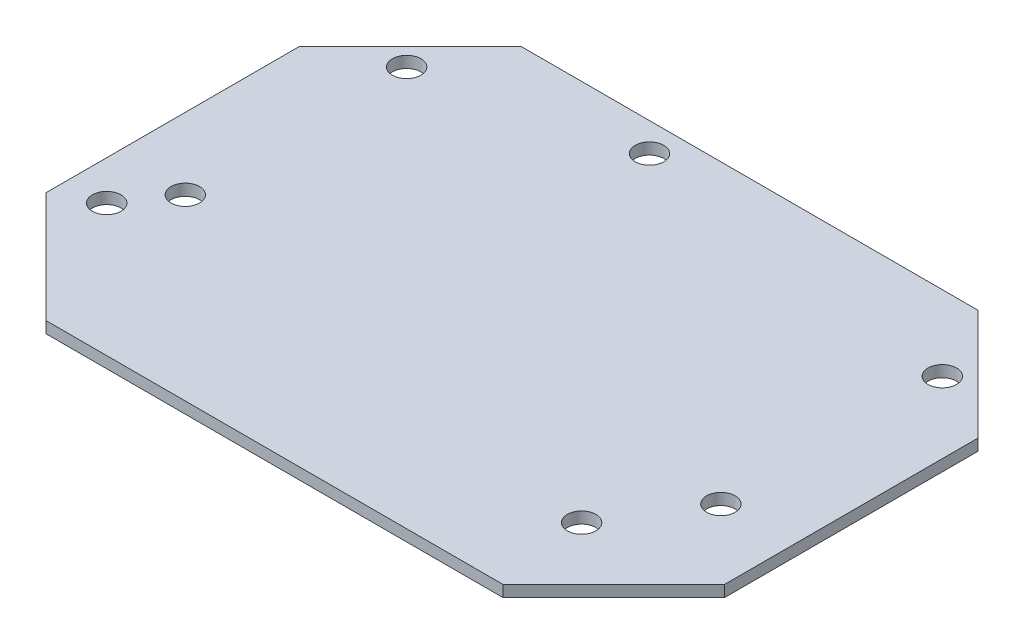
ISO-10303-21;
HEADER;
FILE_DESCRIPTION(('STEP AP214'),'2;1');
FILE_NAME('part.step','',(''),(''),'','','');
FILE_SCHEMA(('AUTOMOTIVE_DESIGN { 1 0 10303 214 1 1 1 1 }'));
ENDSEC;
DATA;
#1=APPLICATION_CONTEXT('core data for automotive mechanical design processes');
#2=APPLICATION_PROTOCOL_DEFINITION('international standard','automotive_design',2000,#1);
#3=PRODUCT_CONTEXT('',#1,'mechanical');
#4=PRODUCT('Part','Part','',(#3));
#5=PRODUCT_RELATED_PRODUCT_CATEGORY('part','',(#4));
#6=PRODUCT_DEFINITION_FORMATION('','',#4);
#7=PRODUCT_DEFINITION_CONTEXT('part definition',#1,'design');
#8=PRODUCT_DEFINITION('design','',#6,#7);
#9=PRODUCT_DEFINITION_SHAPE('','',#8);
#10=(LENGTH_UNIT() NAMED_UNIT(*) SI_UNIT(.MILLI.,.METRE.));
#11=(NAMED_UNIT(*) PLANE_ANGLE_UNIT() SI_UNIT($,.RADIAN.));
#12=(NAMED_UNIT(*) SI_UNIT($,.STERADIAN.) SOLID_ANGLE_UNIT());
#13=UNCERTAINTY_MEASURE_WITH_UNIT(LENGTH_MEASURE(1.E-05),#10,'distance_accuracy_value','');
#14=(GEOMETRIC_REPRESENTATION_CONTEXT(3) GLOBAL_UNCERTAINTY_ASSIGNED_CONTEXT((#13)) GLOBAL_UNIT_ASSIGNED_CONTEXT((#10,
#11,#12)) REPRESENTATION_CONTEXT('',''));
#15=CARTESIAN_POINT('',(0.,0.,0.));
#16=DIRECTION('',(0.,0.,1.));
#17=DIRECTION('',(1.,0.,0.));
#18=AXIS2_PLACEMENT_3D('',#15,#16,#17);
#19=CARTESIAN_POINT('',(0.,1.6,-15.5));
#20=DIRECTION('',(-1.,0.,0.));
#21=DIRECTION('',(0.,0.,1.));
#22=AXIS2_PLACEMENT_3D('',#19,#20,#21);
#23=PLANE('',#22);
#24=DIRECTION('',(0.,0.,-1.));
#25=VECTOR('',#24,1.);
#26=CARTESIAN_POINT('',(0.,0.,-15.5));
#27=LINE('',#26,#25);
#28=CARTESIAN_POINT('',(0.,0.,-15.5));
#29=VERTEX_POINT('',#28);
#30=CARTESIAN_POINT('',(0.,0.,-51.));
#31=VERTEX_POINT('',#30);
#32=EDGE_CURVE('E131',#29,#31,#27,.T.);
#33=ORIENTED_EDGE('',*,*,#32,.F.);
#34=DIRECTION('',(0.,-1.,0.));
#35=VECTOR('',#34,1.);
#36=CARTESIAN_POINT('',(0.,1.6,-15.5));
#37=LINE('',#36,#35);
#38=CARTESIAN_POINT('',(0.,1.6,-15.5));
#39=VERTEX_POINT('',#38);
#40=EDGE_CURVE('E11',#39,#29,#37,.T.);
#41=ORIENTED_EDGE('',*,*,#40,.F.);
#42=DIRECTION('',(0.,0.,-1.));
#43=VECTOR('',#42,1.);
#44=CARTESIAN_POINT('',(0.,1.6,-15.5));
#45=LINE('',#44,#43);
#46=CARTESIAN_POINT('',(0.,1.6,-51.));
#47=VERTEX_POINT('',#46);
#48=EDGE_CURVE('E149',#39,#47,#45,.T.);
#49=ORIENTED_EDGE('',*,*,#48,.T.);
#50=DIRECTION('',(0.,-1.,0.));
#51=VECTOR('',#50,1.);
#52=CARTESIAN_POINT('',(0.,1.6,-51.));
#53=LINE('',#52,#51);
#54=EDGE_CURVE('E36',#47,#31,#53,.T.);
#55=ORIENTED_EDGE('',*,*,#54,.T.);
#56=EDGE_LOOP('',(#33,#41,#49,#55));
#57=FACE_BOUND('',#56,.T.);
#58=ADVANCED_FACE('F33',(#57),#23,.T.);
#59=CARTESIAN_POINT('',(0.,1.6,-15.5));
#60=DIRECTION('',(0.707106781186548,0.,-0.707106781186548));
#61=DIRECTION('',(-0.707106781186548,0.,-0.707106781186548));
#62=AXIS2_PLACEMENT_3D('',#59,#60,#61);
#63=PLANE('',#62);
#64=DIRECTION('',(0.707106781186548,0.,0.707106781186548));
#65=VECTOR('',#64,1.);
#66=CARTESIAN_POINT('',(0.,0.,-15.5));
#67=LINE('',#66,#65);
#68=CARTESIAN_POINT('',(15.5,0.,0.));
#69=VERTEX_POINT('',#68);
#70=EDGE_CURVE('E78',#29,#69,#67,.T.);
#71=ORIENTED_EDGE('',*,*,#70,.T.);
#72=DIRECTION('',(0.,-1.,0.));
#73=VECTOR('',#72,1.);
#74=CARTESIAN_POINT('',(15.5,1.6,0.));
#75=LINE('',#74,#73);
#76=CARTESIAN_POINT('',(15.5,1.6,0.));
#77=VERTEX_POINT('',#76);
#78=EDGE_CURVE('E42',#77,#69,#75,.T.);
#79=ORIENTED_EDGE('',*,*,#78,.F.);
#80=DIRECTION('',(0.707106781186548,0.,0.707106781186548));
#81=VECTOR('',#80,1.);
#82=CARTESIAN_POINT('',(0.,1.6,-15.5));
#83=LINE('',#82,#81);
#84=EDGE_CURVE('E109',#39,#77,#83,.T.);
#85=ORIENTED_EDGE('',*,*,#84,.F.);
#86=ORIENTED_EDGE('',*,*,#40,.T.);
#87=EDGE_LOOP('',(#71,#79,#85,#86));
#88=FACE_BOUND('',#87,.T.);
#89=ADVANCED_FACE('F251',(#88),#63,.F.);
#90=CARTESIAN_POINT('',(15.5,1.6,0.));
#91=DIRECTION('',(0.,0.,-1.));
#92=DIRECTION('',(-1.,0.,0.));
#93=AXIS2_PLACEMENT_3D('',#90,#91,#92);
#94=PLANE('',#93);
#95=DIRECTION('',(1.,0.,0.));
#96=VECTOR('',#95,1.);
#97=CARTESIAN_POINT('',(15.5,0.,0.));
#98=LINE('',#97,#96);
#99=CARTESIAN_POINT('',(79.4999999999998,0.,0.));
#100=VERTEX_POINT('',#99);
#101=EDGE_CURVE('E116',#69,#100,#98,.T.);
#102=ORIENTED_EDGE('',*,*,#101,.T.);
#103=DIRECTION('',(0.,-1.,0.));
#104=VECTOR('',#103,1.);
#105=CARTESIAN_POINT('',(79.4999999999998,1.6,0.));
#106=LINE('',#105,#104);
#107=CARTESIAN_POINT('',(79.4999999999998,1.6,0.));
#108=VERTEX_POINT('',#107);
#109=EDGE_CURVE('E113',#108,#100,#106,.T.);
#110=ORIENTED_EDGE('',*,*,#109,.F.);
#111=DIRECTION('',(1.,0.,0.));
#112=VECTOR('',#111,1.);
#113=CARTESIAN_POINT('',(15.5,1.6,0.));
#114=LINE('',#113,#112);
#115=EDGE_CURVE('E103',#77,#108,#114,.T.);
#116=ORIENTED_EDGE('',*,*,#115,.F.);
#117=ORIENTED_EDGE('',*,*,#78,.T.);
#118=EDGE_LOOP('',(#102,#110,#116,#117));
#119=FACE_BOUND('',#118,.T.);
#120=ADVANCED_FACE('F114',(#119),#94,.F.);
#121=CARTESIAN_POINT('',(95.,1.6,-15.5));
#122=DIRECTION('',(0.707106781186544,0.,0.707106781186551));
#123=DIRECTION('',(0.707106781186551,0.,-0.707106781186544));
#124=AXIS2_PLACEMENT_3D('',#121,#122,#123);
#125=PLANE('',#124);
#126=DIRECTION('',(-0.707106781186551,0.,0.707106781186544));
#127=VECTOR('',#126,1.);
#128=CARTESIAN_POINT('',(95.,0.,-15.5));
#129=LINE('',#128,#127);
#130=CARTESIAN_POINT('',(95.,0.,-15.5));
#131=VERTEX_POINT('',#130);
#132=EDGE_CURVE('E146',#131,#100,#129,.T.);
#133=ORIENTED_EDGE('',*,*,#132,.F.);
#134=DIRECTION('',(0.,-1.,0.));
#135=VECTOR('',#134,1.);
#136=CARTESIAN_POINT('',(95.,1.6,-15.5));
#137=LINE('',#136,#135);
#138=CARTESIAN_POINT('',(95.,1.6,-15.5));
#139=VERTEX_POINT('',#138);
#140=EDGE_CURVE('E120',#139,#131,#137,.T.);
#141=ORIENTED_EDGE('',*,*,#140,.F.);
#142=DIRECTION('',(-0.707106781186551,0.,0.707106781186544));
#143=VECTOR('',#142,1.);
#144=CARTESIAN_POINT('',(95.,1.6,-15.5));
#145=LINE('',#144,#143);
#146=EDGE_CURVE('E108',#139,#108,#145,.T.);
#147=ORIENTED_EDGE('',*,*,#146,.T.);
#148=ORIENTED_EDGE('',*,*,#109,.T.);
#149=EDGE_LOOP('',(#133,#141,#147,#148));
#150=FACE_BOUND('',#149,.T.);
#151=ADVANCED_FACE('F122',(#150),#125,.T.);
#152=CARTESIAN_POINT('',(95.,1.6,-15.5));
#153=DIRECTION('',(-1.,0.,0.));
#154=DIRECTION('',(0.,0.,1.));
#155=AXIS2_PLACEMENT_3D('',#152,#153,#154);
#156=PLANE('',#155);
#157=DIRECTION('',(0.,0.,-1.));
#158=VECTOR('',#157,1.);
#159=CARTESIAN_POINT('',(95.,0.,-15.5));
#160=LINE('',#159,#158);
#161=CARTESIAN_POINT('',(95.,0.,-51.));
#162=VERTEX_POINT('',#161);
#163=EDGE_CURVE('E144',#131,#162,#160,.T.);
#164=ORIENTED_EDGE('',*,*,#163,.T.);
#165=DIRECTION('',(0.,-1.,0.));
#166=VECTOR('',#165,1.);
#167=CARTESIAN_POINT('',(95.,1.6,-51.));
#168=LINE('',#167,#166);
#169=CARTESIAN_POINT('',(95.,1.6,-51.));
#170=VERTEX_POINT('',#169);
#171=EDGE_CURVE('E153',#170,#162,#168,.T.);
#172=ORIENTED_EDGE('',*,*,#171,.F.);
#173=DIRECTION('',(0.,0.,-1.));
#174=VECTOR('',#173,1.);
#175=CARTESIAN_POINT('',(95.,1.6,-15.5));
#176=LINE('',#175,#174);
#177=EDGE_CURVE('E124',#139,#170,#176,.T.);
#178=ORIENTED_EDGE('',*,*,#177,.F.);
#179=ORIENTED_EDGE('',*,*,#140,.T.);
#180=EDGE_LOOP('',(#164,#172,#178,#179));
#181=FACE_BOUND('',#180,.T.);
#182=ADVANCED_FACE('F166',(#181),#156,.F.);
#183=CARTESIAN_POINT('',(95.,1.6,-51.));
#184=DIRECTION('',(-0.707106781186546,0.,0.707106781186549));
#185=DIRECTION('',(0.707106781186549,0.,0.707106781186546));
#186=AXIS2_PLACEMENT_3D('',#183,#184,#185);
#187=PLANE('',#186);
#188=DIRECTION('',(-0.707106781186549,0.,-0.707106781186546));
#189=VECTOR('',#188,1.);
#190=CARTESIAN_POINT('',(95.,0.,-51.));
#191=LINE('',#190,#189);
#192=CARTESIAN_POINT('',(79.4999999999999,0.,-66.5));
#193=VERTEX_POINT('',#192);
#194=EDGE_CURVE('E141',#162,#193,#191,.T.);
#195=ORIENTED_EDGE('',*,*,#194,.T.);
#196=DIRECTION('',(0.,-1.,0.));
#197=VECTOR('',#196,1.);
#198=CARTESIAN_POINT('',(79.4999999999999,1.6,-66.5));
#199=LINE('',#198,#197);
#200=CARTESIAN_POINT('',(79.4999999999999,1.6,-66.5));
#201=VERTEX_POINT('',#200);
#202=EDGE_CURVE('E156',#201,#193,#199,.T.);
#203=ORIENTED_EDGE('',*,*,#202,.F.);
#204=DIRECTION('',(-0.707106781186549,0.,-0.707106781186546));
#205=VECTOR('',#204,1.);
#206=CARTESIAN_POINT('',(95.,1.6,-51.));
#207=LINE('',#206,#205);
#208=EDGE_CURVE('E126',#170,#201,#207,.T.);
#209=ORIENTED_EDGE('',*,*,#208,.F.);
#210=ORIENTED_EDGE('',*,*,#171,.T.);
#211=EDGE_LOOP('',(#195,#203,#209,#210));
#212=FACE_BOUND('',#211,.T.);
#213=ADVANCED_FACE('F169',(#212),#187,.F.);
#214=CARTESIAN_POINT('',(15.5,1.6,-66.5));
#215=DIRECTION('',(0.,0.,-1.));
#216=DIRECTION('',(-1.,0.,0.));
#217=AXIS2_PLACEMENT_3D('',#214,#215,#216);
#218=PLANE('',#217);
#219=DIRECTION('',(1.,0.,0.));
#220=VECTOR('',#219,1.);
#221=CARTESIAN_POINT('',(15.5,0.,-66.5));
#222=LINE('',#221,#220);
#223=CARTESIAN_POINT('',(15.5,0.,-66.5));
#224=VERTEX_POINT('',#223);
#225=EDGE_CURVE('E138',#224,#193,#222,.T.);
#226=ORIENTED_EDGE('',*,*,#225,.F.);
#227=DIRECTION('',(0.,-1.,0.));
#228=VECTOR('',#227,1.);
#229=CARTESIAN_POINT('',(15.5,1.6,-66.5));
#230=LINE('',#229,#228);
#231=CARTESIAN_POINT('',(15.5,1.6,-66.5));
#232=VERTEX_POINT('',#231);
#233=EDGE_CURVE('E157',#232,#224,#230,.T.);
#234=ORIENTED_EDGE('',*,*,#233,.F.);
#235=DIRECTION('',(1.,0.,0.));
#236=VECTOR('',#235,1.);
#237=CARTESIAN_POINT('',(15.5,1.6,-66.5));
#238=LINE('',#237,#236);
#239=EDGE_CURVE('E173',#232,#201,#238,.T.);
#240=ORIENTED_EDGE('',*,*,#239,.T.);
#241=ORIENTED_EDGE('',*,*,#202,.T.);
#242=EDGE_LOOP('',(#226,#234,#240,#241));
#243=FACE_BOUND('',#242,.T.);
#244=ADVANCED_FACE('F267',(#243),#218,.T.);
#245=CARTESIAN_POINT('',(0.,1.6,-51.));
#246=DIRECTION('',(-0.707106781186548,0.,-0.707106781186547));
#247=DIRECTION('',(-0.707106781186547,0.,0.707106781186548));
#248=AXIS2_PLACEMENT_3D('',#245,#246,#247);
#249=PLANE('',#248);
#250=DIRECTION('',(0.707106781186547,0.,-0.707106781186548));
#251=VECTOR('',#250,1.);
#252=CARTESIAN_POINT('',(0.,0.,-51.));
#253=LINE('',#252,#251);
#254=EDGE_CURVE('E134',#31,#224,#253,.T.);
#255=ORIENTED_EDGE('',*,*,#254,.F.);
#256=ORIENTED_EDGE('',*,*,#54,.F.);
#257=DIRECTION('',(0.707106781186547,0.,-0.707106781186548));
#258=VECTOR('',#257,1.);
#259=CARTESIAN_POINT('',(0.,1.6,-51.));
#260=LINE('',#259,#258);
#261=EDGE_CURVE('E174',#47,#232,#260,.T.);
#262=ORIENTED_EDGE('',*,*,#261,.T.);
#263=ORIENTED_EDGE('',*,*,#233,.T.);
#264=EDGE_LOOP('',(#255,#256,#262,#263));
#265=FACE_BOUND('',#264,.T.);
#266=ADVANCED_FACE('F159',(#265),#249,.T.);
#267=CARTESIAN_POINT('',(0.,1.6,0.));
#268=DIRECTION('',(0.,-1.,0.));
#269=DIRECTION('',(0.,0.,-1.));
#270=AXIS2_PLACEMENT_3D('',#267,#268,#269);
#271=PLANE('',#270);
#272=CARTESIAN_POINT('',(9.99999999999999,1.6,-25.));
#273=DIRECTION('',(0.,1.,0.));
#274=DIRECTION('',(0.,0.,1.));
#275=AXIS2_PLACEMENT_3D('',#272,#273,#274);
#276=CIRCLE('',#275,2.);
#277=CARTESIAN_POINT('',(9.99999999999999,1.6,-23.));
#278=VERTEX_POINT('',#277);
#279=EDGE_CURVE('E206',#278,#278,#276,.T.);
#280=ORIENTED_EDGE('',*,*,#279,.F.);
#281=EDGE_LOOP('',(#280));
#282=FACE_BOUND('',#281,.T.);
#283=CARTESIAN_POINT('',(85.,1.6,-25.));
#284=DIRECTION('',(0.,1.,0.));
#285=DIRECTION('',(0.,0.,1.));
#286=AXIS2_PLACEMENT_3D('',#283,#284,#285);
#287=CIRCLE('',#286,2.);
#288=CARTESIAN_POINT('',(85.,1.6,-23.));
#289=VERTEX_POINT('',#288);
#290=EDGE_CURVE('E212',#289,#289,#287,.T.);
#291=ORIENTED_EDGE('',*,*,#290,.F.);
#292=EDGE_LOOP('',(#291));
#293=FACE_BOUND('',#292,.T.);
#294=CARTESIAN_POINT('',(85.,1.6,-56.));
#295=DIRECTION('',(0.,1.,0.));
#296=DIRECTION('',(0.,0.,1.));
#297=AXIS2_PLACEMENT_3D('',#294,#295,#296);
#298=CIRCLE('',#297,2.);
#299=CARTESIAN_POINT('',(85.,1.6,-54.));
#300=VERTEX_POINT('',#299);
#301=EDGE_CURVE('E200',#300,#300,#298,.T.);
#302=ORIENTED_EDGE('',*,*,#301,.F.);
#303=EDGE_LOOP('',(#302));
#304=FACE_BOUND('',#303,.T.);
#305=CARTESIAN_POINT('',(9.99999999999999,1.6,-56.));
#306=DIRECTION('',(0.,1.,0.));
#307=DIRECTION('',(0.,0.,1.));
#308=AXIS2_PLACEMENT_3D('',#305,#306,#307);
#309=CIRCLE('',#308,2.);
#310=CARTESIAN_POINT('',(9.99999999999999,1.6,-54.));
#311=VERTEX_POINT('',#310);
#312=EDGE_CURVE('E183',#311,#311,#309,.T.);
#313=ORIENTED_EDGE('',*,*,#312,.F.);
#314=EDGE_LOOP('',(#313));
#315=FACE_BOUND('',#314,.T.);
#316=CARTESIAN_POINT('',(5.5,1.6,-18.5));
#317=DIRECTION('',(0.,1.,0.));
#318=DIRECTION('',(0.,0.,1.));
#319=AXIS2_PLACEMENT_3D('',#316,#317,#318);
#320=CIRCLE('',#319,2.);
#321=CARTESIAN_POINT('',(5.5,1.6,-16.5));
#322=VERTEX_POINT('',#321);
#323=EDGE_CURVE('E192',#322,#322,#320,.T.);
#324=ORIENTED_EDGE('',*,*,#323,.F.);
#325=EDGE_LOOP('',(#324));
#326=FACE_BOUND('',#325,.T.);
#327=CARTESIAN_POINT('',(77.5,1.6,-13.));
#328=DIRECTION('',(0.,1.,0.));
#329=DIRECTION('',(0.,0.,1.));
#330=AXIS2_PLACEMENT_3D('',#327,#328,#329);
#331=CIRCLE('',#330,2.);
#332=CARTESIAN_POINT('',(77.5,1.6,-11.));
#333=VERTEX_POINT('',#332);
#334=EDGE_CURVE('E186',#333,#333,#331,.T.);
#335=ORIENTED_EDGE('',*,*,#334,.F.);
#336=EDGE_LOOP('',(#335));
#337=FACE_BOUND('',#336,.T.);
#338=CARTESIAN_POINT('',(37.5,1.6,-62.5));
#339=DIRECTION('',(0.,1.,0.));
#340=DIRECTION('',(0.,0.,1.));
#341=AXIS2_PLACEMENT_3D('',#338,#339,#340);
#342=CIRCLE('',#341,2.);
#343=CARTESIAN_POINT('',(37.5,1.6,-60.5));
#344=VERTEX_POINT('',#343);
#345=EDGE_CURVE('E179',#344,#344,#342,.T.);
#346=ORIENTED_EDGE('',*,*,#345,.F.);
#347=EDGE_LOOP('',(#346));
#348=FACE_BOUND('',#347,.T.);
#349=ORIENTED_EDGE('',*,*,#48,.F.);
#350=ORIENTED_EDGE('',*,*,#84,.T.);
#351=ORIENTED_EDGE('',*,*,#115,.T.);
#352=ORIENTED_EDGE('',*,*,#146,.F.);
#353=ORIENTED_EDGE('',*,*,#177,.T.);
#354=ORIENTED_EDGE('',*,*,#208,.T.);
#355=ORIENTED_EDGE('',*,*,#239,.F.);
#356=ORIENTED_EDGE('',*,*,#261,.F.);
#357=EDGE_LOOP('',(#349,#350,#351,#352,#353,#354,#355,#356));
#358=FACE_BOUND('',#357,.T.);
#359=ADVANCED_FACE('F106',(#282,#293,#304,#315,#326,#337,#348,#358),#271,.F.);
#360=CARTESIAN_POINT('',(0.,0.,0.));
#361=DIRECTION('',(0.,-1.,0.));
#362=DIRECTION('',(0.,0.,-1.));
#363=AXIS2_PLACEMENT_3D('',#360,#361,#362);
#364=PLANE('',#363);
#365=CARTESIAN_POINT('',(9.99999999999999,0.,-25.));
#366=DIRECTION('',(0.,-1.,0.));
#367=DIRECTION('',(0.,0.,-1.));
#368=AXIS2_PLACEMENT_3D('',#365,#366,#367);
#369=CIRCLE('',#368,2.);
#370=CARTESIAN_POINT('',(9.99999999999999,0.,-27.));
#371=VERTEX_POINT('',#370);
#372=EDGE_CURVE('E203',#371,#371,#369,.F.);
#373=ORIENTED_EDGE('',*,*,#372,.T.);
#374=EDGE_LOOP('',(#373));
#375=FACE_BOUND('',#374,.T.);
#376=CARTESIAN_POINT('',(85.,0.,-25.));
#377=DIRECTION('',(0.,-1.,0.));
#378=DIRECTION('',(0.,0.,-1.));
#379=AXIS2_PLACEMENT_3D('',#376,#377,#378);
#380=CIRCLE('',#379,2.);
#381=CARTESIAN_POINT('',(85.,0.,-27.));
#382=VERTEX_POINT('',#381);
#383=EDGE_CURVE('E209',#382,#382,#380,.F.);
#384=ORIENTED_EDGE('',*,*,#383,.T.);
#385=EDGE_LOOP('',(#384));
#386=FACE_BOUND('',#385,.T.);
#387=CARTESIAN_POINT('',(85.,0.,-56.));
#388=DIRECTION('',(0.,-1.,0.));
#389=DIRECTION('',(0.,0.,-1.));
#390=AXIS2_PLACEMENT_3D('',#387,#388,#389);
#391=CIRCLE('',#390,2.);
#392=CARTESIAN_POINT('',(85.,0.,-58.));
#393=VERTEX_POINT('',#392);
#394=EDGE_CURVE('E215',#393,#393,#391,.F.);
#395=ORIENTED_EDGE('',*,*,#394,.T.);
#396=EDGE_LOOP('',(#395));
#397=FACE_BOUND('',#396,.T.);
#398=CARTESIAN_POINT('',(9.99999999999999,0.,-56.));
#399=DIRECTION('',(0.,-1.,0.));
#400=DIRECTION('',(0.,0.,-1.));
#401=AXIS2_PLACEMENT_3D('',#398,#399,#400);
#402=CIRCLE('',#401,2.);
#403=CARTESIAN_POINT('',(9.99999999999999,0.,-58.));
#404=VERTEX_POINT('',#403);
#405=EDGE_CURVE('E197',#404,#404,#402,.F.);
#406=ORIENTED_EDGE('',*,*,#405,.T.);
#407=EDGE_LOOP('',(#406));
#408=FACE_BOUND('',#407,.T.);
#409=CARTESIAN_POINT('',(5.5,0.,-18.5));
#410=DIRECTION('',(0.,1.,0.));
#411=DIRECTION('',(0.,0.,1.));
#412=AXIS2_PLACEMENT_3D('',#409,#410,#411);
#413=CIRCLE('',#412,2.);
#414=CARTESIAN_POINT('',(5.5,0.,-16.5));
#415=VERTEX_POINT('',#414);
#416=EDGE_CURVE('E135',#415,#415,#413,.T.);
#417=ORIENTED_EDGE('',*,*,#416,.T.);
#418=EDGE_LOOP('',(#417));
#419=FACE_BOUND('',#418,.T.);
#420=CARTESIAN_POINT('',(77.5,0.,-13.));
#421=DIRECTION('',(0.,1.,0.));
#422=DIRECTION('',(0.,0.,1.));
#423=AXIS2_PLACEMENT_3D('',#420,#421,#422);
#424=CIRCLE('',#423,2.);
#425=CARTESIAN_POINT('',(77.5,0.,-11.));
#426=VERTEX_POINT('',#425);
#427=EDGE_CURVE('E189',#426,#426,#424,.T.);
#428=ORIENTED_EDGE('',*,*,#427,.T.);
#429=EDGE_LOOP('',(#428));
#430=FACE_BOUND('',#429,.T.);
#431=CARTESIAN_POINT('',(37.5,0.,-62.5));
#432=DIRECTION('',(0.,1.,0.));
#433=DIRECTION('',(0.,0.,1.));
#434=AXIS2_PLACEMENT_3D('',#431,#432,#433);
#435=CIRCLE('',#434,2.);
#436=CARTESIAN_POINT('',(37.5,0.,-60.5));
#437=VERTEX_POINT('',#436);
#438=EDGE_CURVE('E182',#437,#437,#435,.T.);
#439=ORIENTED_EDGE('',*,*,#438,.T.);
#440=EDGE_LOOP('',(#439));
#441=FACE_BOUND('',#440,.T.);
#442=ORIENTED_EDGE('',*,*,#32,.T.);
#443=ORIENTED_EDGE('',*,*,#254,.T.);
#444=ORIENTED_EDGE('',*,*,#225,.T.);
#445=ORIENTED_EDGE('',*,*,#194,.F.);
#446=ORIENTED_EDGE('',*,*,#163,.F.);
#447=ORIENTED_EDGE('',*,*,#132,.T.);
#448=ORIENTED_EDGE('',*,*,#101,.F.);
#449=ORIENTED_EDGE('',*,*,#70,.F.);
#450=EDGE_LOOP('',(#442,#443,#444,#445,#446,#447,#448,#449));
#451=FACE_BOUND('',#450,.T.);
#452=ADVANCED_FACE('F161',(#375,#386,#397,#408,#419,#430,#441,#451),#364,.T.);
#453=CARTESIAN_POINT('',(37.5,0.,-62.5));
#454=DIRECTION('',(0.,1.,0.));
#455=DIRECTION('',(0.,0.,1.));
#456=AXIS2_PLACEMENT_3D('',#453,#454,#455);
#457=CYLINDRICAL_SURFACE('',#456,2.);
#458=ORIENTED_EDGE('',*,*,#438,.F.);
#459=EDGE_LOOP('',(#458));
#460=FACE_BOUND('',#459,.T.);
#461=ORIENTED_EDGE('',*,*,#345,.T.);
#462=EDGE_LOOP('',(#461));
#463=FACE_BOUND('',#462,.T.);
#464=ADVANCED_FACE('F235',(#460,#463),#457,.F.);
#465=CARTESIAN_POINT('',(77.5,0.,-13.));
#466=DIRECTION('',(0.,1.,0.));
#467=DIRECTION('',(0.,0.,1.));
#468=AXIS2_PLACEMENT_3D('',#465,#466,#467);
#469=CYLINDRICAL_SURFACE('',#468,2.);
#470=ORIENTED_EDGE('',*,*,#427,.F.);
#471=EDGE_LOOP('',(#470));
#472=FACE_BOUND('',#471,.T.);
#473=ORIENTED_EDGE('',*,*,#334,.T.);
#474=EDGE_LOOP('',(#473));
#475=FACE_BOUND('',#474,.T.);
#476=ADVANCED_FACE('F237',(#472,#475),#469,.F.);
#477=CARTESIAN_POINT('',(5.5,0.,-18.5));
#478=DIRECTION('',(0.,1.,0.));
#479=DIRECTION('',(0.,0.,1.));
#480=AXIS2_PLACEMENT_3D('',#477,#478,#479);
#481=CYLINDRICAL_SURFACE('',#480,2.);
#482=ORIENTED_EDGE('',*,*,#416,.F.);
#483=EDGE_LOOP('',(#482));
#484=FACE_BOUND('',#483,.T.);
#485=ORIENTED_EDGE('',*,*,#323,.T.);
#486=EDGE_LOOP('',(#485));
#487=FACE_BOUND('',#486,.T.);
#488=ADVANCED_FACE('F244',(#484,#487),#481,.F.);
#489=CARTESIAN_POINT('',(9.99999999999999,-0.000999999999999916,-56.));
#490=DIRECTION('',(0.,1.,0.));
#491=DIRECTION('',(0.,0.,1.));
#492=AXIS2_PLACEMENT_3D('',#489,#490,#491);
#493=CYLINDRICAL_SURFACE('',#492,2.);
#494=ORIENTED_EDGE('',*,*,#405,.F.);
#495=EDGE_LOOP('',(#494));
#496=FACE_BOUND('',#495,.T.);
#497=ORIENTED_EDGE('',*,*,#312,.T.);
#498=EDGE_LOOP('',(#497));
#499=FACE_BOUND('',#498,.T.);
#500=ADVANCED_FACE('F290',(#496,#499),#493,.F.);
#501=CARTESIAN_POINT('',(85.,-0.000999999999999916,-56.));
#502=DIRECTION('',(0.,1.,0.));
#503=DIRECTION('',(0.,0.,1.));
#504=AXIS2_PLACEMENT_3D('',#501,#502,#503);
#505=CYLINDRICAL_SURFACE('',#504,2.);
#506=ORIENTED_EDGE('',*,*,#394,.F.);
#507=EDGE_LOOP('',(#506));
#508=FACE_BOUND('',#507,.T.);
#509=ORIENTED_EDGE('',*,*,#301,.T.);
#510=EDGE_LOOP('',(#509));
#511=FACE_BOUND('',#510,.T.);
#512=ADVANCED_FACE('F221',(#508,#511),#505,.F.);
#513=CARTESIAN_POINT('',(85.,-0.000999999999999916,-25.));
#514=DIRECTION('',(0.,1.,0.));
#515=DIRECTION('',(0.,0.,1.));
#516=AXIS2_PLACEMENT_3D('',#513,#514,#515);
#517=CYLINDRICAL_SURFACE('',#516,2.);
#518=ORIENTED_EDGE('',*,*,#383,.F.);
#519=EDGE_LOOP('',(#518));
#520=FACE_BOUND('',#519,.T.);
#521=ORIENTED_EDGE('',*,*,#290,.T.);
#522=EDGE_LOOP('',(#521));
#523=FACE_BOUND('',#522,.T.);
#524=ADVANCED_FACE('F306',(#520,#523),#517,.F.);
#525=CARTESIAN_POINT('',(9.99999999999999,-0.000999999999999916,-25.));
#526=DIRECTION('',(0.,1.,0.));
#527=DIRECTION('',(0.,0.,1.));
#528=AXIS2_PLACEMENT_3D('',#525,#526,#527);
#529=CYLINDRICAL_SURFACE('',#528,2.);
#530=ORIENTED_EDGE('',*,*,#372,.F.);
#531=EDGE_LOOP('',(#530));
#532=FACE_BOUND('',#531,.T.);
#533=ORIENTED_EDGE('',*,*,#279,.T.);
#534=EDGE_LOOP('',(#533));
#535=FACE_BOUND('',#534,.T.);
#536=ADVANCED_FACE('F316',(#532,#535),#529,.F.);
#537=CLOSED_SHELL('',(#58,#89,#120,#151,#182,#213,#244,#266,#359,#452,#464,#476,#488,#500,#512,
#524,#536));
#538=MANIFOLD_SOLID_BREP('B2',#537);
#539=ADVANCED_BREP_SHAPE_REPRESENTATION('',(#18,#538),#14);
#540=SHAPE_DEFINITION_REPRESENTATION(#9,#539);
ENDSEC;
END-ISO-10303-21;
